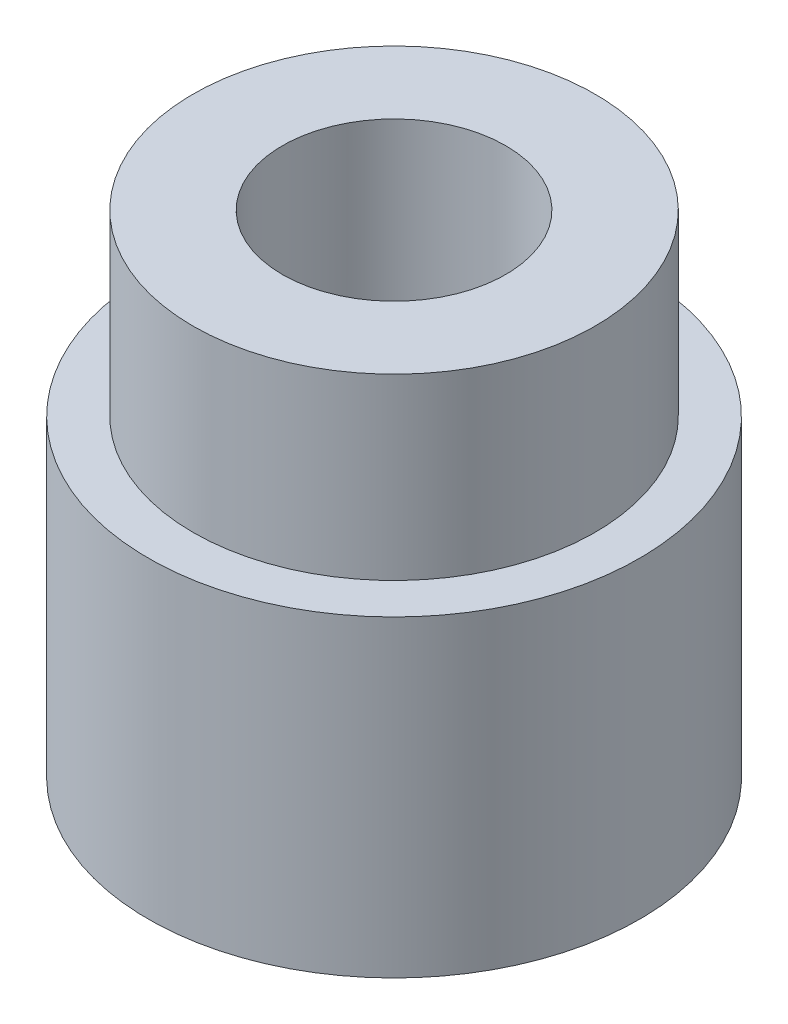
ISO-10303-21;
HEADER;
FILE_DESCRIPTION(('STEP AP214'),'2;1');
FILE_NAME('part.step','',(''),(''),'','','');
FILE_SCHEMA(('AUTOMOTIVE_DESIGN { 1 0 10303 214 1 1 1 1 }'));
ENDSEC;
DATA;
#1=APPLICATION_CONTEXT('core data for automotive mechanical design processes');
#2=APPLICATION_PROTOCOL_DEFINITION('international standard','automotive_design',2000,#1);
#3=PRODUCT_CONTEXT('',#1,'mechanical');
#4=PRODUCT('Part','Part','',(#3));
#5=PRODUCT_RELATED_PRODUCT_CATEGORY('part','',(#4));
#6=PRODUCT_DEFINITION_FORMATION('','',#4);
#7=PRODUCT_DEFINITION_CONTEXT('part definition',#1,'design');
#8=PRODUCT_DEFINITION('design','',#6,#7);
#9=PRODUCT_DEFINITION_SHAPE('','',#8);
#10=(LENGTH_UNIT() NAMED_UNIT(*) SI_UNIT(.MILLI.,.METRE.));
#11=(NAMED_UNIT(*) PLANE_ANGLE_UNIT() SI_UNIT($,.RADIAN.));
#12=(NAMED_UNIT(*) SI_UNIT($,.STERADIAN.) SOLID_ANGLE_UNIT());
#13=UNCERTAINTY_MEASURE_WITH_UNIT(LENGTH_MEASURE(1.E-05),#10,'distance_accuracy_value','');
#14=(GEOMETRIC_REPRESENTATION_CONTEXT(3) GLOBAL_UNCERTAINTY_ASSIGNED_CONTEXT((#13)) GLOBAL_UNIT_ASSIGNED_CONTEXT((#10,
#11,#12)) REPRESENTATION_CONTEXT('',''));
#15=CARTESIAN_POINT('',(0.,0.,0.));
#16=DIRECTION('',(0.,0.,1.));
#17=DIRECTION('',(1.,0.,0.));
#18=AXIS2_PLACEMENT_3D('',#15,#16,#17);
#19=CARTESIAN_POINT('',(0.,4.,0.));
#20=DIRECTION('',(0.,1.,0.));
#21=DIRECTION('',(0.,0.,1.));
#22=AXIS2_PLACEMENT_3D('',#19,#20,#21);
#23=PLANE('',#22);
#24=CARTESIAN_POINT('',(0.,4.,0.));
#25=DIRECTION('',(0.,1.,0.));
#26=DIRECTION('',(0.,0.,1.));
#27=AXIS2_PLACEMENT_3D('',#24,#25,#26);
#28=CIRCLE('',#27,4.5);
#29=CARTESIAN_POINT('',(0.,4.,4.5));
#30=VERTEX_POINT('',#29);
#31=EDGE_CURVE('E10',#30,#30,#28,.T.);
#32=ORIENTED_EDGE('',*,*,#31,.T.);
#33=EDGE_LOOP('',(#32));
#34=FACE_BOUND('',#33,.T.);
#35=CARTESIAN_POINT('',(0.,4.,0.));
#36=DIRECTION('',(0.,1.,0.));
#37=DIRECTION('',(0.,0.,1.));
#38=AXIS2_PLACEMENT_3D('',#35,#36,#37);
#39=CIRCLE('',#38,2.5);
#40=CARTESIAN_POINT('',(0.,4.,2.5));
#41=VERTEX_POINT('',#40);
#42=EDGE_CURVE('E43',#41,#41,#39,.T.);
#43=ORIENTED_EDGE('',*,*,#42,.F.);
#44=EDGE_LOOP('',(#43));
#45=FACE_BOUND('',#44,.T.);
#46=ADVANCED_FACE('F35',(#34,#45),#23,.T.);
#47=CARTESIAN_POINT('',(0.,4.,0.));
#48=DIRECTION('',(0.,-1.,0.));
#49=DIRECTION('',(0.,0.,-1.));
#50=AXIS2_PLACEMENT_3D('',#47,#48,#49);
#51=CYLINDRICAL_SURFACE('',#50,4.5);
#52=ORIENTED_EDGE('',*,*,#31,.F.);
#53=EDGE_LOOP('',(#52));
#54=FACE_BOUND('',#53,.T.);
#55=CARTESIAN_POINT('',(0.,0.,0.));
#56=DIRECTION('',(0.,1.,0.));
#57=DIRECTION('',(0.,0.,1.));
#58=AXIS2_PLACEMENT_3D('',#55,#56,#57);
#59=CIRCLE('',#58,4.5);
#60=CARTESIAN_POINT('',(0.,0.,4.5));
#61=VERTEX_POINT('',#60);
#62=EDGE_CURVE('E39',#61,#61,#59,.T.);
#63=ORIENTED_EDGE('',*,*,#62,.T.);
#64=EDGE_LOOP('',(#63));
#65=FACE_BOUND('',#64,.T.);
#66=ADVANCED_FACE('F37',(#54,#65),#51,.T.);
#67=CARTESIAN_POINT('',(0.,4.,0.));
#68=DIRECTION('',(0.,-1.,0.));
#69=DIRECTION('',(0.,0.,-1.));
#70=AXIS2_PLACEMENT_3D('',#67,#68,#69);
#71=CYLINDRICAL_SURFACE('',#70,2.5);
#72=ORIENTED_EDGE('',*,*,#42,.T.);
#73=EDGE_LOOP('',(#72));
#74=FACE_BOUND('',#73,.T.);
#75=CARTESIAN_POINT('',(0.,-7.,0.));
#76=DIRECTION('',(0.,-1.,0.));
#77=DIRECTION('',(0.,0.,-1.));
#78=AXIS2_PLACEMENT_3D('',#75,#76,#77);
#79=CIRCLE('',#78,2.5);
#80=CARTESIAN_POINT('',(0.,-7.,-2.5));
#81=VERTEX_POINT('',#80);
#82=EDGE_CURVE('E53',#81,#81,#79,.T.);
#83=ORIENTED_EDGE('',*,*,#82,.T.);
#84=EDGE_LOOP('',(#83));
#85=FACE_BOUND('',#84,.T.);
#86=ADVANCED_FACE('F59',(#74,#85),#71,.F.);
#87=CARTESIAN_POINT('',(0.,-7.,0.));
#88=DIRECTION('',(0.,-1.,0.));
#89=DIRECTION('',(0.,0.,-1.));
#90=AXIS2_PLACEMENT_3D('',#87,#88,#89);
#91=PLANE('',#90);
#92=CARTESIAN_POINT('',(0.,-7.,0.));
#93=DIRECTION('',(0.,-1.,0.));
#94=DIRECTION('',(0.,0.,-1.));
#95=AXIS2_PLACEMENT_3D('',#92,#93,#94);
#96=CIRCLE('',#95,5.5);
#97=CARTESIAN_POINT('',(0.,-7.,-5.5));
#98=VERTEX_POINT('',#97);
#99=EDGE_CURVE('E52',#98,#98,#96,.T.);
#100=ORIENTED_EDGE('',*,*,#99,.T.);
#101=EDGE_LOOP('',(#100));
#102=FACE_BOUND('',#101,.T.);
#103=ORIENTED_EDGE('',*,*,#82,.F.);
#104=EDGE_LOOP('',(#103));
#105=FACE_BOUND('',#104,.T.);
#106=ADVANCED_FACE('F61',(#102,#105),#91,.T.);
#107=CARTESIAN_POINT('',(0.,0.,0.));
#108=DIRECTION('',(0.,-1.,0.));
#109=DIRECTION('',(0.,0.,-1.));
#110=AXIS2_PLACEMENT_3D('',#107,#108,#109);
#111=PLANE('',#110);
#112=ORIENTED_EDGE('',*,*,#62,.F.);
#113=EDGE_LOOP('',(#112));
#114=FACE_BOUND('',#113,.T.);
#115=CARTESIAN_POINT('',(0.,0.,0.));
#116=DIRECTION('',(0.,-1.,0.));
#117=DIRECTION('',(0.,0.,-1.));
#118=AXIS2_PLACEMENT_3D('',#115,#116,#117);
#119=CIRCLE('',#118,5.5);
#120=CARTESIAN_POINT('',(0.,0.,-5.5));
#121=VERTEX_POINT('',#120);
#122=EDGE_CURVE('E49',#121,#121,#119,.T.);
#123=ORIENTED_EDGE('',*,*,#122,.F.);
#124=EDGE_LOOP('',(#123));
#125=FACE_BOUND('',#124,.T.);
#126=ADVANCED_FACE('F63',(#114,#125),#111,.F.);
#127=CARTESIAN_POINT('',(0.,-7.,0.));
#128=DIRECTION('',(0.,1.,0.));
#129=DIRECTION('',(0.,0.,1.));
#130=AXIS2_PLACEMENT_3D('',#127,#128,#129);
#131=CYLINDRICAL_SURFACE('',#130,5.5);
#132=ORIENTED_EDGE('',*,*,#99,.F.);
#133=EDGE_LOOP('',(#132));
#134=FACE_BOUND('',#133,.T.);
#135=ORIENTED_EDGE('',*,*,#122,.T.);
#136=EDGE_LOOP('',(#135));
#137=FACE_BOUND('',#136,.T.);
#138=ADVANCED_FACE('F70',(#134,#137),#131,.T.);
#139=CLOSED_SHELL('',(#46,#66,#86,#106,#126,#138));
#140=MANIFOLD_SOLID_BREP('B2',#139);
#141=ADVANCED_BREP_SHAPE_REPRESENTATION('',(#18,#140),#14);
#142=SHAPE_DEFINITION_REPRESENTATION(#9,#141);
ENDSEC;
END-ISO-10303-21;
